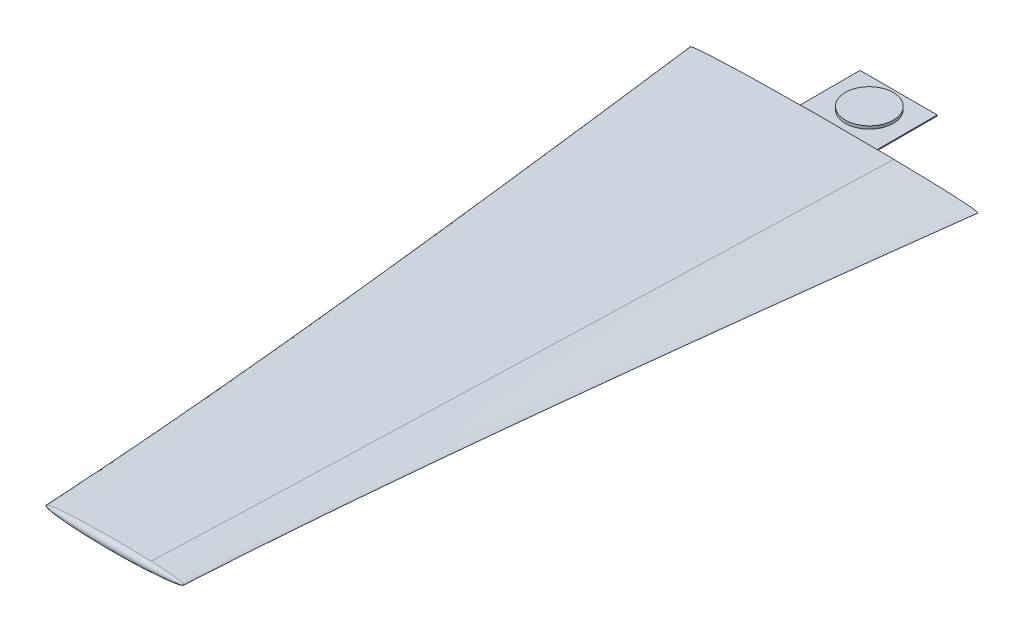
ISO-10303-21;
HEADER;
FILE_DESCRIPTION(('STEP AP214'),'2;1');
FILE_NAME('part.step','',(''),(''),'','','');
FILE_SCHEMA(('AUTOMOTIVE_DESIGN { 1 0 10303 214 1 1 1 1 }'));
ENDSEC;
DATA;
#1=APPLICATION_CONTEXT('core data for automotive mechanical design processes');
#2=APPLICATION_PROTOCOL_DEFINITION('international standard','automotive_design',2000,#1);
#3=PRODUCT_CONTEXT('',#1,'mechanical');
#4=PRODUCT('Part','Part','',(#3));
#5=PRODUCT_RELATED_PRODUCT_CATEGORY('part','',(#4));
#6=PRODUCT_DEFINITION_FORMATION('','',#4);
#7=PRODUCT_DEFINITION_CONTEXT('part definition',#1,'design');
#8=PRODUCT_DEFINITION('design','',#6,#7);
#9=PRODUCT_DEFINITION_SHAPE('','',#8);
#10=(LENGTH_UNIT() NAMED_UNIT(*) SI_UNIT(.MILLI.,.METRE.));
#11=(NAMED_UNIT(*) PLANE_ANGLE_UNIT() SI_UNIT($,.RADIAN.));
#12=(NAMED_UNIT(*) SI_UNIT($,.STERADIAN.) SOLID_ANGLE_UNIT());
#13=UNCERTAINTY_MEASURE_WITH_UNIT(LENGTH_MEASURE(1.E-05),#10,'distance_accuracy_value','');
#14=(GEOMETRIC_REPRESENTATION_CONTEXT(3) GLOBAL_UNCERTAINTY_ASSIGNED_CONTEXT((#13)) GLOBAL_UNIT_ASSIGNED_CONTEXT((#10,
#11,#12)) REPRESENTATION_CONTEXT('',''));
#15=CARTESIAN_POINT('',(0.,0.,0.));
#16=DIRECTION('',(0.,0.,1.));
#17=DIRECTION('',(1.,0.,0.));
#18=AXIS2_PLACEMENT_3D('',#15,#16,#17);
#19=CARTESIAN_POINT('',(31.282856856667,4.50113798534183,750.));
#20=CARTESIAN_POINT('',(-40.9427903275989,4.81013835793043,0.));
#21=CARTESIAN_POINT('',(160.637105883311,0.146941463863787,750.));
#22=CARTESIAN_POINT('',(247.665511148227,7.53965771310369,0.));
#23=CARTESIAN_POINT('',(98.0713921699774,-8.85533450681988,750.));
#24=CARTESIAN_POINT('',(329.551091803425,-2.08061900275717,0.));
#25=CARTESIAN_POINT('',(-31.282856856667,-4.50113798534183,750.));
#26=CARTESIAN_POINT('',(40.9427903275988,-4.81013835793043,0.));
#27=CARTESIAN_POINT('',(-160.637105883311,-0.146941463863786,750.));
#28=CARTESIAN_POINT('',(-247.665511148227,-7.53965771310369,0.));
#29=CARTESIAN_POINT('',(-98.0713921699774,8.85533450681988,750.));
#30=CARTESIAN_POINT('',(-329.551091803425,2.08061900275717,0.));
#31=CARTESIAN_POINT('',(31.282856856667,4.50113798534183,750.));
#32=CARTESIAN_POINT('',(-40.9427903275989,4.81013835793043,0.));
#33=(BOUNDED_SURFACE() B_SPLINE_SURFACE(3,1,((#19,#20),(#21,#22),(#23,#24),(#25,#26),(#27,#28),
(#29,#30),(#31,#32)),.UNSPECIFIED.,.T.,.F.,.F.) B_SPLINE_SURFACE_WITH_KNOTS((4,3,4),(2,2),(0.,
0.5,1.),(0.,1.),.UNSPECIFIED.) GEOMETRIC_REPRESENTATION_ITEM() RATIONAL_B_SPLINE_SURFACE(((1.,
1.),(0.333333333333333,0.333333333333333),(0.333333333333333,0.333333333333333),(1.,1.),
(0.333333333333333,0.333333333333333),(0.333333333333333,0.333333333333333),(1.,1.))) REPRESENTATION_ITEM('') SURFACE());
#34=CARTESIAN_POINT('',(71.8453030366391,0.,750.));
#35=CARTESIAN_POINT('',(71.8453030366391,10.,750.));
#36=CARTESIAN_POINT('',(-71.8453030366391,10.,750.));
#37=CARTESIAN_POINT('',(-71.8453030366391,0.,750.));
#38=CARTESIAN_POINT('',(-71.8453030366391,-10.,750.));
#39=CARTESIAN_POINT('',(71.8453030366391,-10.,750.));
#40=CARTESIAN_POINT('',(71.8453030366391,0.,750.));
#41=(BOUNDED_CURVE() B_SPLINE_CURVE(3,(#34,#35,#36,#37,#38,#39,#40),.UNSPECIFIED.,.T.,
.F.) B_SPLINE_CURVE_WITH_KNOTS((4,3,4),(0.,0.5,1.),
.UNSPECIFIED.) CURVE() GEOMETRIC_REPRESENTATION_ITEM() RATIONAL_B_SPLINE_CURVE((1.,
0.333333333333333,0.333333333333333,1.,0.333333333333333,0.333333333333333,1.)) REPRESENTATION_ITEM(''));
#42=CARTESIAN_POINT('',(37.7130748085056,-4.25575620007162,750.));
#43=VERTEX_POINT('',#42);
#44=CARTESIAN_POINT('',(37.7130748085055,4.25575620007162,750.));
#45=VERTEX_POINT('',#44);
#46=EDGE_CURVE('E147',#43,#45,#41,.T.);
#47=CARTESIAN_POINT('',(37.7130748085056,-4.25575620007162,750.));
#48=CARTESIAN_POINT('',(38.0227711184767,-4.2643173257584,740.521382443869));
#49=CARTESIAN_POINT('',(38.332467447474,-4.27223126344653,731.042764305416));
#50=CARTESIAN_POINT('',(38.9518601365364,-4.28677980781952,712.08552707765));
#51=CARTESIAN_POINT('',(39.2615564966013,-4.29341441450846,702.606907988337));
#52=CARTESIAN_POINT('',(39.8809492313382,-4.3054193417096,683.649669362649));
#53=CARTESIAN_POINT('',(40.1906456060101,-4.31078966226854,674.171049826273));
#54=CARTESIAN_POINT('',(40.8100383745813,-4.32036365437632,655.213810165048));
#55=CARTESIAN_POINT('',(41.1197347684805,-4.32456732592442,645.735190040198));
#56=CARTESIAN_POINT('',(42.0488239245604,-4.33562677520309,617.29933044971));
#57=CARTESIAN_POINT('',(42.6682167063705,-4.34093098840886,598.34209038329));
#58=CARTESIAN_POINT('',(43.9070022911826,-4.34879965227551,560.42760960185));
#59=CARTESIAN_POINT('',(44.5263950941845,-4.35136410291104,541.470368886831));
#60=CARTESIAN_POINT('',(45.7651806392394,-4.3552196633382,503.555889322205));
#61=CARTESIAN_POINT('',(46.3845733812924,-4.35651077326214,484.598650472598));
#62=CARTESIAN_POINT('',(47.6233588692612,-4.35907946610402,446.684172655158));
#63=CARTESIAN_POINT('',(48.242751615177,-4.36035704902187,427.726933687324));
#64=CARTESIAN_POINT('',(49.4815371048654,-4.3638673585473,389.812455817256));
#65=CARTESIAN_POINT('',(50.1009298486379,-4.3661000851553,370.855216915022));
#66=CARTESIAN_POINT('',(51.3397153277391,-4.37219633506874,332.940739368986));
#67=CARTESIAN_POINT('',(51.9591080630679,-4.37605985837316,313.983500725183));
#68=CARTESIAN_POINT('',(53.1978935201151,-4.38584583614149,276.069023854131));
#69=CARTESIAN_POINT('',(53.8172862418337,-4.39176829061639,257.111785626882));
#70=CARTESIAN_POINT('',(55.0560716573738,-4.40590552001447,219.197310026213));
#71=CARTESIAN_POINT('',(55.6754643511955,-4.41412029493754,200.240072652795));
#72=CARTESIAN_POINT('',(57.282012845202,-4.4385346243211,151.069778174637));
#73=CARTESIAN_POINT('',(58.2691686160465,-4.45657911617211,120.856721967854));
#74=CARTESIAN_POINT('',(60.2434800191969,-4.49867832494298,60.4306137948089));
#75=CARTESIAN_POINT('',(61.2306356515027,-4.52273304185032,30.2175618285472));
#76=CARTESIAN_POINT('',(62.2178403448515,-4.54959170480294,0.00300829102405837));
#77=CARTESIAN_POINT('',(62.2178894900261,-4.54959304189194,0.00150414551202599));
#78=CARTESIAN_POINT('',(62.2179386352007,-4.54959437898789,0.));
#79=B_SPLINE_CURVE_WITH_KNOTS('',3,(#47,#48,#49,#50,#51,#52,#53,#54,#55,#56,#57,#58,#59,#60,#61,
#62,#63,#64,#65,#66,#67,#68,#69,#70,#71,#72,#73,#74,#75,#76,#77,#78),.UNSPECIFIED.,.F.,.F.,(4,2,
2,2,2,2,2,2,2,2,2,2,2,2,2,4),(0.,28.4510383199521,56.9020765491339,85.3531137262654,
113.8041509214,170.706221154926,227.6082919148,284.510356761582,341.41242196471,
398.314487192336,455.216552384604,512.11861788052,569.020683373156,659.7082348501,
750.395786138051,750.400300984318),.UNSPECIFIED.);
#80=CARTESIAN_POINT('',(62.2179386598495,-4.54959600130463,0.));
#81=VERTEX_POINT('',#80);
#82=EDGE_CURVE('E12',#43,#81,#79,.T.);
#83=CARTESIAN_POINT('',(0.,0.,0.));
#84=DIRECTION('',(0.,0.,1.));
#85=DIRECTION('',(1.,0.,0.));
#86=AXIS2_PLACEMENT_3D('',#83,#84,#85);
#87=ELLIPSE('',#86,150.,5.);
#88=CARTESIAN_POINT('',(62.2179386616077,4.54959611699391,0.));
#89=VERTEX_POINT('',#88);
#90=EDGE_CURVE('E151',#81,#89,#87,.T.);
#91=CARTESIAN_POINT('',(62.2179386352007,4.54959437898789,0.));
#92=CARTESIAN_POINT('',(61.8175929615323,4.51523845701476,12.2530472878692));
#93=CARTESIAN_POINT('',(61.4172472346927,4.48146426248991,24.5060962031061));
#94=CARTESIAN_POINT('',(60.6165556645733,4.41521738219739,49.0121975973664));
#95=CARTESIAN_POINT('',(60.2162098212935,4.38274469643521,61.26525007639));
#96=CARTESIAN_POINT('',(59.0151721109955,4.28748598385328,98.0244130366114));
#97=CARTESIAN_POINT('',(58.2144800592318,4.22685930136729,122.530529172159));
#98=CARTESIAN_POINT('',(56.6130954216653,4.11276586509315,171.542777788146));
#99=CARTESIAN_POINT('',(55.8124028358625,4.05929911117639,196.048910268585));
#100=CARTESIAN_POINT('',(54.2110169893778,3.96136134879147,245.061195884927));
#101=CARTESIAN_POINT('',(53.4103237286958,3.91689034122063,269.567349020832));
#102=CARTESIAN_POINT('',(51.808936589692,3.83933651603089,318.579674196229));
#103=CARTESIAN_POINT('',(51.0082427113703,3.80625369862866,343.085846235721));
#104=CARTESIAN_POINT('',(49.4068542749689,3.75456904174836,392.09821111949));
#105=CARTESIAN_POINT('',(48.6061597168891,3.7359672051895,416.60440396377));
#106=CARTESIAN_POINT('',(47.0047703544055,3.71714314995626,465.616797191368));
#107=CARTESIAN_POINT('',(46.2040755500016,3.71692093063919,490.122997574687));
#108=CARTESIAN_POINT('',(44.7625318860807,3.73721457722863,534.243126361645));
#109=CARTESIAN_POINT('',(44.1216829674105,3.75359927915291,553.857056575739));
#110=CARTESIAN_POINT('',(42.8399858165683,3.80356057719567,593.084895992844));
#111=CARTESIAN_POINT('',(42.1991375843962,3.8371371730924,612.698805195856));
#112=CARTESIAN_POINT('',(41.2379054633414,3.90185788535972,642.11843779981));
#113=CARTESIAN_POINT('',(40.9175210472987,3.92582218865305,651.92417733509));
#114=CARTESIAN_POINT('',(40.2767526479581,3.97865712861947,671.535643160973));
#115=CARTESIAN_POINT('',(39.9563686646601,4.0075277652279,681.341369451577));
#116=CARTESIAN_POINT('',(39.3156012306382,4.07019165420872,700.95280573281));
#117=CARTESIAN_POINT('',(38.9952177799143,4.1039849063105,710.758515723441));
#118=CARTESIAN_POINT('',(38.3544514578919,4.17634251666182,730.369917970416));
#119=CARTESIAN_POINT('',(38.0340685865934,4.21490687481949,740.175610226762));
#120=CARTESIAN_POINT('',(37.7134822832138,4.25570434260129,749.987528760277));
#121=CARTESIAN_POINT('',(37.7132785458596,4.25573027089019,749.99376438014));
#122=CARTESIAN_POINT('',(37.7130748085056,4.25575620007162,750.));
#123=B_SPLINE_CURVE_WITH_KNOTS('',3,(#91,#92,#93,#94,#95,#96,#97,#98,#99,#100,#101,#102,#103,
#104,#105,#106,#107,#108,#109,#110,#111,#112,#113,#114,#115,#116,#117,#118,#119,#120,#121,#122),
.UNSPECIFIED.,.F.,.F.,(4,2,2,2,2,2,2,2,2,2,2,2,2,2,2,4),(0.,36.7789018533299,73.55780386165,
147.115607484481,220.67340978618,294.231219425318,367.789030463911,441.346856330951,
514.904679625869,573.777884127335,632.651087869413,662.084091008914,691.517093760481,
720.950094894093,750.383095460997,750.401812464668),.UNSPECIFIED.);
#124=EDGE_CURVE('E65',#89,#45,#123,.T.);
#125=ORIENTED_EDGE('',*,*,#46,.F.);
#126=ORIENTED_EDGE('',*,*,#82,.T.);
#127=ORIENTED_EDGE('',*,*,#90,.T.);
#128=ORIENTED_EDGE('',*,*,#124,.T.);
#129=EDGE_LOOP('',(#125,#126,#127,#128));
#130=FACE_BOUND('',#129,.T.);
#131=ADVANCED_FACE('F51',(#130),#33,.T.);
#132=CARTESIAN_POINT('',(0.,0.,0.));
#133=DIRECTION('',(0.,0.,1.));
#134=DIRECTION('',(1.,0.,0.));
#135=AXIS2_PLACEMENT_3D('',#132,#133,#134);
#136=PLANE('',#135);
#137=DIRECTION('',(0.,-1.,0.));
#138=VECTOR('',#137,1.);
#139=CARTESIAN_POINT('',(-40.244530445749,0.,0.));
#140=LINE('',#139,#138);
#141=CARTESIAN_POINT('',(-40.244530445749,0.,0.));
#142=VERTEX_POINT('',#141);
#143=CARTESIAN_POINT('',(-40.244530445749,-1.,0.));
#144=VERTEX_POINT('',#143);
#145=EDGE_CURVE('E263',#142,#144,#140,.T.);
#146=ORIENTED_EDGE('',*,*,#145,.T.);
#147=DIRECTION('',(1.,0.,0.));
#148=VECTOR('',#147,1.);
#149=CARTESIAN_POINT('',(0.,-1.,0.));
#150=LINE('',#149,#148);
#151=CARTESIAN_POINT('',(40.244530445749,-1.,0.));
#152=VERTEX_POINT('',#151);
#153=EDGE_CURVE('E262',#144,#152,#150,.T.);
#154=ORIENTED_EDGE('',*,*,#153,.T.);
#155=DIRECTION('',(0.,1.,0.));
#156=VECTOR('',#155,1.);
#157=CARTESIAN_POINT('',(40.244530445749,0.,0.));
#158=LINE('',#157,#156);
#159=CARTESIAN_POINT('',(40.244530445749,0.,0.));
#160=VERTEX_POINT('',#159);
#161=EDGE_CURVE('E119',#152,#160,#158,.T.);
#162=ORIENTED_EDGE('',*,*,#161,.T.);
#163=DIRECTION('',(1.,0.,0.));
#164=VECTOR('',#163,1.);
#165=CARTESIAN_POINT('',(0.,0.,0.));
#166=LINE('',#165,#164);
#167=EDGE_CURVE('E197',#142,#160,#166,.T.);
#168=ORIENTED_EDGE('',*,*,#167,.F.);
#169=EDGE_LOOP('',(#146,#154,#162,#168));
#170=FACE_BOUND('',#169,.T.);
#171=ORIENTED_EDGE('',*,*,#90,.F.);
#172=EDGE_CURVE('E198',#89,#81,#87,.T.);
#173=ORIENTED_EDGE('',*,*,#172,.F.);
#174=EDGE_LOOP('',(#171,#173));
#175=FACE_BOUND('',#174,.T.);
#176=ADVANCED_FACE('F224',(#170,#175),#136,.F.);
#177=CARTESIAN_POINT('',(71.8453030366391,0.,750.));
#178=CARTESIAN_POINT('',(71.8453030366391,0.,755.));
#179=CARTESIAN_POINT('',(0.,0.,755.));
#180=CARTESIAN_POINT('',(71.8453030366391,10.,750.));
#181=CARTESIAN_POINT('',(71.8453030366391,10.,755.));
#182=CARTESIAN_POINT('',(0.,0.,755.));
#183=CARTESIAN_POINT('',(-71.8453030366391,10.,750.));
#184=CARTESIAN_POINT('',(-71.8453030366391,10.,755.));
#185=CARTESIAN_POINT('',(0.,0.,755.));
#186=CARTESIAN_POINT('',(-71.8453030366391,0.,750.));
#187=CARTESIAN_POINT('',(-71.8453030366391,0.,755.));
#188=CARTESIAN_POINT('',(0.,0.,755.));
#189=CARTESIAN_POINT('',(-71.8453030366391,-10.,750.));
#190=CARTESIAN_POINT('',(-71.8453030366391,-10.,755.));
#191=CARTESIAN_POINT('',(0.,0.,755.));
#192=CARTESIAN_POINT('',(71.8453030366391,-10.,750.));
#193=CARTESIAN_POINT('',(71.8453030366391,-10.,755.));
#194=CARTESIAN_POINT('',(0.,0.,755.));
#195=CARTESIAN_POINT('',(71.8453030366391,0.,750.));
#196=CARTESIAN_POINT('',(71.8453030366391,0.,755.));
#197=CARTESIAN_POINT('',(0.,0.,755.));
#198=(BOUNDED_SURFACE() B_SPLINE_SURFACE(3,2,((#177,#178,#179),(#180,#181,#182),(#183,#184,
#185),(#186,#187,#188),(#189,#190,#191),(#192,#193,#194),(#195,#196,#197)),.UNSPECIFIED.,.T.,
.F.,.F.) B_SPLINE_SURFACE_WITH_KNOTS((4,3,4),(3,3),(0.,0.5,1.),(0.,1.),
.UNSPECIFIED.) GEOMETRIC_REPRESENTATION_ITEM() RATIONAL_B_SPLINE_SURFACE(((1.,0.707106781186548,
1.),(0.333333333333333,0.235702260395516,0.333333333333333),(0.333333333333333,
0.235702260395516,0.333333333333333),(1.,0.707106781186548,1.),(0.333333333333333,
0.235702260395516,0.333333333333333),(0.333333333333333,0.235702260395516,0.333333333333333),
(1.,0.707106781186548,1.))) REPRESENTATION_ITEM('') SURFACE());
#199=CARTESIAN_POINT('',(71.8453030366391,0.,750.));
#200=CARTESIAN_POINT('',(71.8453030366391,10.,750.));
#201=CARTESIAN_POINT('',(-71.8453030366391,10.,750.));
#202=CARTESIAN_POINT('',(-71.8453030366391,0.,750.));
#203=CARTESIAN_POINT('',(-71.8453030366391,-10.,750.));
#204=CARTESIAN_POINT('',(71.8453030366391,-10.,750.));
#205=CARTESIAN_POINT('',(71.8453030366391,0.,750.));
#206=(BOUNDED_CURVE() B_SPLINE_CURVE(3,(#199,#200,#201,#202,#203,#204,#205),.UNSPECIFIED.,.T.,
.F.) B_SPLINE_CURVE_WITH_KNOTS((4,3,4),(0.,0.5,1.),
.UNSPECIFIED.) CURVE() GEOMETRIC_REPRESENTATION_ITEM() RATIONAL_B_SPLINE_CURVE((1.,
0.333333333333333,0.333333333333333,1.,0.333333333333333,0.333333333333333,1.)) REPRESENTATION_ITEM(''));
#207=EDGE_CURVE('E209',#45,#43,#206,.T.);
#208=CARTESIAN_POINT('',(0.,0.,755.));
#209=VERTEX_POINT('',#208);
#210=VERTEX_LOOP('',#209);
#211=FACE_BOUND('',#210,.T.);
#212=ORIENTED_EDGE('',*,*,#207,.T.);
#213=ORIENTED_EDGE('',*,*,#46,.T.);
#214=EDGE_LOOP('',(#212,#213));
#215=FACE_BOUND('',#214,.T.);
#216=ADVANCED_FACE('F168',(#211,#215),#198,.T.);
#217=ORIENTED_EDGE('',*,*,#82,.F.);
#218=ORIENTED_EDGE('',*,*,#207,.F.);
#219=ORIENTED_EDGE('',*,*,#124,.F.);
#220=ORIENTED_EDGE('',*,*,#172,.T.);
#221=EDGE_LOOP('',(#217,#218,#219,#220));
#222=FACE_BOUND('',#221,.T.);
#223=ADVANCED_FACE('F157',(#222),#33,.T.);
#224=CARTESIAN_POINT('',(40.244530445749,-1.,67.2545284158734));
#225=DIRECTION('',(1.,0.,0.));
#226=DIRECTION('',(0.,0.,-1.));
#227=AXIS2_PLACEMENT_3D('',#224,#225,#226);
#228=PLANE('',#227);
#229=ORIENTED_EDGE('',*,*,#161,.F.);
#230=DIRECTION('',(0.,0.,-1.));
#231=VECTOR('',#230,1.);
#232=CARTESIAN_POINT('',(40.244530445749,-1.,67.2545284158734));
#233=LINE('',#232,#231);
#234=CARTESIAN_POINT('',(40.244530445749,-1.,-67.2545284158734));
#235=VERTEX_POINT('',#234);
#236=EDGE_CURVE('E113',#152,#235,#233,.T.);
#237=ORIENTED_EDGE('',*,*,#236,.T.);
#238=DIRECTION('',(0.,1.,0.));
#239=VECTOR('',#238,1.);
#240=CARTESIAN_POINT('',(40.244530445749,-1.,-67.2545284158734));
#241=LINE('',#240,#239);
#242=CARTESIAN_POINT('',(40.244530445749,0.,-67.2545284158734));
#243=VERTEX_POINT('',#242);
#244=EDGE_CURVE('E117',#235,#243,#241,.T.);
#245=ORIENTED_EDGE('',*,*,#244,.T.);
#246=DIRECTION('',(0.,0.,-1.));
#247=VECTOR('',#246,1.);
#248=CARTESIAN_POINT('',(40.244530445749,0.,67.2545284158734));
#249=LINE('',#248,#247);
#250=EDGE_CURVE('E141',#160,#243,#249,.T.);
#251=ORIENTED_EDGE('',*,*,#250,.F.);
#252=EDGE_LOOP('',(#229,#237,#245,#251));
#253=FACE_BOUND('',#252,.T.);
#254=ADVANCED_FACE('F115',(#253),#228,.T.);
#255=CARTESIAN_POINT('',(-40.244530445749,-1.,67.2545284158734));
#256=DIRECTION('',(-1.,0.,0.));
#257=DIRECTION('',(0.,0.,1.));
#258=AXIS2_PLACEMENT_3D('',#255,#256,#257);
#259=PLANE('',#258);
#260=ORIENTED_EDGE('',*,*,#145,.F.);
#261=DIRECTION('',(0.,0.,1.));
#262=VECTOR('',#261,1.);
#263=CARTESIAN_POINT('',(-40.244530445749,0.,67.2545284158734));
#264=LINE('',#263,#262);
#265=CARTESIAN_POINT('',(-40.244530445749,0.,-67.2545284158734));
#266=VERTEX_POINT('',#265);
#267=EDGE_CURVE('E124',#266,#142,#264,.T.);
#268=ORIENTED_EDGE('',*,*,#267,.F.);
#269=DIRECTION('',(0.,1.,0.));
#270=VECTOR('',#269,1.);
#271=CARTESIAN_POINT('',(-40.244530445749,-1.,-67.2545284158734));
#272=LINE('',#271,#270);
#273=CARTESIAN_POINT('',(-40.244530445749,-1.,-67.2545284158734));
#274=VERTEX_POINT('',#273);
#275=EDGE_CURVE('E131',#274,#266,#272,.T.);
#276=ORIENTED_EDGE('',*,*,#275,.F.);
#277=DIRECTION('',(0.,0.,1.));
#278=VECTOR('',#277,1.);
#279=CARTESIAN_POINT('',(-40.244530445749,-1.,67.2545284158734));
#280=LINE('',#279,#278);
#281=EDGE_CURVE('E132',#274,#144,#280,.T.);
#282=ORIENTED_EDGE('',*,*,#281,.T.);
#283=EDGE_LOOP('',(#260,#268,#276,#282));
#284=FACE_BOUND('',#283,.T.);
#285=ADVANCED_FACE('F236',(#284),#259,.T.);
#286=CARTESIAN_POINT('',(0.,-1.,0.));
#287=DIRECTION('',(0.,-1.,0.));
#288=DIRECTION('',(0.,0.,-1.));
#289=AXIS2_PLACEMENT_3D('',#286,#287,#288);
#290=PLANE('',#289);
#291=ORIENTED_EDGE('',*,*,#153,.F.);
#292=ORIENTED_EDGE('',*,*,#281,.F.);
#293=DIRECTION('',(-1.,0.,0.));
#294=VECTOR('',#293,1.);
#295=CARTESIAN_POINT('',(-40.244530445749,-1.,-67.2545284158734));
#296=LINE('',#295,#294);
#297=EDGE_CURVE('E123',#235,#274,#296,.T.);
#298=ORIENTED_EDGE('',*,*,#297,.F.);
#299=ORIENTED_EDGE('',*,*,#236,.F.);
#300=EDGE_LOOP('',(#291,#292,#298,#299));
#301=FACE_BOUND('',#300,.T.);
#302=ADVANCED_FACE('F135',(#301),#290,.T.);
#303=CARTESIAN_POINT('',(0.,0.,0.));
#304=DIRECTION('',(0.,-1.,0.));
#305=DIRECTION('',(0.,0.,-1.));
#306=AXIS2_PLACEMENT_3D('',#303,#304,#305);
#307=PLANE('',#306);
#308=CARTESIAN_POINT('',(0.,0.,-36.6805642237011));
#309=DIRECTION('',(0.,-1.,0.));
#310=DIRECTION('',(0.,0.,-1.));
#311=AXIS2_PLACEMENT_3D('',#308,#309,#310);
#312=CIRCLE('',#311,25.);
#313=CARTESIAN_POINT('',(0.,0.,-61.6805642237011));
#314=VERTEX_POINT('',#313);
#315=EDGE_CURVE('E194',#314,#314,#312,.F.);
#316=ORIENTED_EDGE('',*,*,#315,.F.);
#317=EDGE_LOOP('',(#316));
#318=FACE_BOUND('',#317,.T.);
#319=ORIENTED_EDGE('',*,*,#267,.T.);
#320=ORIENTED_EDGE('',*,*,#167,.T.);
#321=ORIENTED_EDGE('',*,*,#250,.T.);
#322=DIRECTION('',(-1.,0.,0.));
#323=VECTOR('',#322,1.);
#324=CARTESIAN_POINT('',(-40.244530445749,0.,-67.2545284158734));
#325=LINE('',#324,#323);
#326=EDGE_CURVE('E130',#243,#266,#325,.T.);
#327=ORIENTED_EDGE('',*,*,#326,.T.);
#328=EDGE_LOOP('',(#319,#320,#321,#327));
#329=FACE_BOUND('',#328,.T.);
#330=ADVANCED_FACE('F240',(#318,#329),#307,.F.);
#331=CARTESIAN_POINT('',(-40.244530445749,-1.,-67.2545284158734));
#332=DIRECTION('',(0.,0.,-1.));
#333=DIRECTION('',(-1.,0.,0.));
#334=AXIS2_PLACEMENT_3D('',#331,#332,#333);
#335=PLANE('',#334);
#336=ORIENTED_EDGE('',*,*,#326,.F.);
#337=ORIENTED_EDGE('',*,*,#244,.F.);
#338=ORIENTED_EDGE('',*,*,#297,.T.);
#339=ORIENTED_EDGE('',*,*,#275,.T.);
#340=EDGE_LOOP('',(#336,#337,#338,#339));
#341=FACE_BOUND('',#340,.T.);
#342=ADVANCED_FACE('F128',(#341),#335,.T.);
#343=CARTESIAN_POINT('',(0.,3.,-36.6805642237011));
#344=DIRECTION('',(0.,-1.,0.));
#345=DIRECTION('',(0.,0.,-1.));
#346=AXIS2_PLACEMENT_3D('',#343,#344,#345);
#347=CYLINDRICAL_SURFACE('',#346,25.);
#348=CARTESIAN_POINT('',(0.,3.,-36.6805642237011));
#349=DIRECTION('',(0.,1.,0.));
#350=DIRECTION('',(0.,0.,1.));
#351=AXIS2_PLACEMENT_3D('',#348,#349,#350);
#352=CIRCLE('',#351,25.);
#353=CARTESIAN_POINT('',(0.,3.,-11.6805642237011));
#354=VERTEX_POINT('',#353);
#355=EDGE_CURVE('E143',#354,#354,#352,.T.);
#356=ORIENTED_EDGE('',*,*,#355,.F.);
#357=EDGE_LOOP('',(#356));
#358=FACE_BOUND('',#357,.T.);
#359=ORIENTED_EDGE('',*,*,#315,.T.);
#360=EDGE_LOOP('',(#359));
#361=FACE_BOUND('',#360,.T.);
#362=ADVANCED_FACE('F239',(#358,#361),#347,.T.);
#363=CARTESIAN_POINT('',(0.,3.,-36.6805642237011));
#364=DIRECTION('',(0.,1.,0.));
#365=DIRECTION('',(0.,0.,1.));
#366=AXIS2_PLACEMENT_3D('',#363,#364,#365);
#367=PLANE('',#366);
#368=ORIENTED_EDGE('',*,*,#355,.T.);
#369=EDGE_LOOP('',(#368));
#370=FACE_BOUND('',#369,.T.);
#371=ADVANCED_FACE('F251',(#370),#367,.T.);
#372=CLOSED_SHELL('',(#131,#176,#216,#223,#254,#285,#302,#330,#342,#362,#371));
#373=MANIFOLD_SOLID_BREP('B2',#372);
#374=ADVANCED_BREP_SHAPE_REPRESENTATION('',(#18,#373),#14);
#375=SHAPE_DEFINITION_REPRESENTATION(#9,#374);
ENDSEC;
END-ISO-10303-21;
